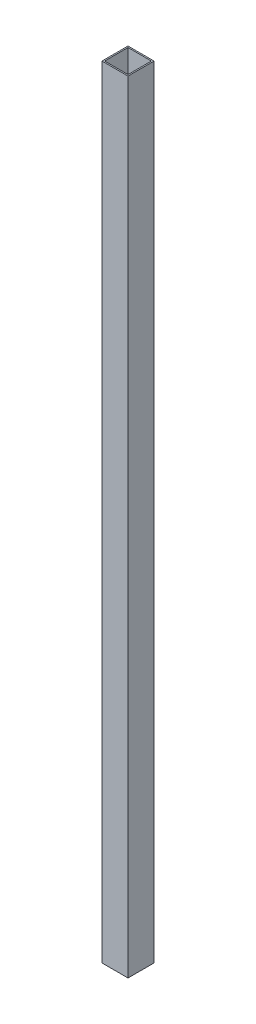
ISO-10303-21;
HEADER;
FILE_DESCRIPTION(('STEP AP214'),'2;1');
FILE_NAME('part.step','',(''),(''),'','','');
FILE_SCHEMA(('AUTOMOTIVE_DESIGN { 1 0 10303 214 1 1 1 1 }'));
ENDSEC;
DATA;
#1=APPLICATION_CONTEXT('core data for automotive mechanical design processes');
#2=APPLICATION_PROTOCOL_DEFINITION('international standard','automotive_design',2000,#1);
#3=PRODUCT_CONTEXT('',#1,'mechanical');
#4=PRODUCT('Part','Part','',(#3));
#5=PRODUCT_RELATED_PRODUCT_CATEGORY('part','',(#4));
#6=PRODUCT_DEFINITION_FORMATION('','',#4);
#7=PRODUCT_DEFINITION_CONTEXT('part definition',#1,'design');
#8=PRODUCT_DEFINITION('design','',#6,#7);
#9=PRODUCT_DEFINITION_SHAPE('','',#8);
#10=(LENGTH_UNIT() NAMED_UNIT(*) SI_UNIT(.MILLI.,.METRE.));
#11=(NAMED_UNIT(*) PLANE_ANGLE_UNIT() SI_UNIT($,.RADIAN.));
#12=(NAMED_UNIT(*) SI_UNIT($,.STERADIAN.) SOLID_ANGLE_UNIT());
#13=UNCERTAINTY_MEASURE_WITH_UNIT(LENGTH_MEASURE(1.E-05),#10,'distance_accuracy_value','');
#14=(GEOMETRIC_REPRESENTATION_CONTEXT(3) GLOBAL_UNCERTAINTY_ASSIGNED_CONTEXT((#13)) GLOBAL_UNIT_ASSIGNED_CONTEXT((#10,
#11,#12)) REPRESENTATION_CONTEXT('',''));
#15=CARTESIAN_POINT('',(0.,0.,0.));
#16=DIRECTION('',(0.,0.,1.));
#17=DIRECTION('',(1.,0.,0.));
#18=AXIS2_PLACEMENT_3D('',#15,#16,#17);
#19=CARTESIAN_POINT('',(0.,600.,0.));
#20=DIRECTION('',(0.,1.,0.));
#21=DIRECTION('',(0.,0.,1.));
#22=AXIS2_PLACEMENT_3D('',#19,#20,#21);
#23=PLANE('',#22);
#24=DIRECTION('',(0.,0.,-1.));
#25=VECTOR('',#24,1.);
#26=CARTESIAN_POINT('',(10.,600.,-10.));
#27=LINE('',#26,#25);
#28=CARTESIAN_POINT('',(10.,600.,10.));
#29=VERTEX_POINT('',#28);
#30=CARTESIAN_POINT('',(10.,600.,-10.));
#31=VERTEX_POINT('',#30);
#32=EDGE_CURVE('E159',#29,#31,#27,.T.);
#33=ORIENTED_EDGE('',*,*,#32,.T.);
#34=DIRECTION('',(-1.,0.,0.));
#35=VECTOR('',#34,1.);
#36=CARTESIAN_POINT('',(-10.,600.,-10.));
#37=LINE('',#36,#35);
#38=CARTESIAN_POINT('',(-10.,600.,-10.));
#39=VERTEX_POINT('',#38);
#40=EDGE_CURVE('E163',#31,#39,#37,.T.);
#41=ORIENTED_EDGE('',*,*,#40,.T.);
#42=DIRECTION('',(0.,0.,1.));
#43=VECTOR('',#42,1.);
#44=CARTESIAN_POINT('',(-10.,600.,-10.));
#45=LINE('',#44,#43);
#46=CARTESIAN_POINT('',(-10.,600.,10.));
#47=VERTEX_POINT('',#46);
#48=EDGE_CURVE('E167',#39,#47,#45,.T.);
#49=ORIENTED_EDGE('',*,*,#48,.T.);
#50=DIRECTION('',(1.,0.,0.));
#51=VECTOR('',#50,1.);
#52=CARTESIAN_POINT('',(-10.,600.,10.));
#53=LINE('',#52,#51);
#54=EDGE_CURVE('E170',#47,#29,#53,.T.);
#55=ORIENTED_EDGE('',*,*,#54,.T.);
#56=EDGE_LOOP('',(#33,#41,#49,#55));
#57=FACE_BOUND('',#56,.T.);
#58=DIRECTION('',(-1.,0.,0.));
#59=VECTOR('',#58,1.);
#60=CARTESIAN_POINT('',(-9.,600.,-9.));
#61=LINE('',#60,#59);
#62=CARTESIAN_POINT('',(9.,600.,-9.));
#63=VERTEX_POINT('',#62);
#64=CARTESIAN_POINT('',(-9.,600.,-9.));
#65=VERTEX_POINT('',#64);
#66=EDGE_CURVE('E120',#63,#65,#61,.T.);
#67=ORIENTED_EDGE('',*,*,#66,.F.);
#68=DIRECTION('',(0.,0.,-1.));
#69=VECTOR('',#68,1.);
#70=CARTESIAN_POINT('',(9.,600.,-9.));
#71=LINE('',#70,#69);
#72=CARTESIAN_POINT('',(9.,600.,9.));
#73=VERTEX_POINT('',#72);
#74=EDGE_CURVE('E111',#73,#63,#71,.T.);
#75=ORIENTED_EDGE('',*,*,#74,.F.);
#76=DIRECTION('',(1.,0.,0.));
#77=VECTOR('',#76,1.);
#78=CARTESIAN_POINT('',(-9.,600.,9.));
#79=LINE('',#78,#77);
#80=CARTESIAN_POINT('',(-9.,600.,9.));
#81=VERTEX_POINT('',#80);
#82=EDGE_CURVE('E137',#81,#73,#79,.T.);
#83=ORIENTED_EDGE('',*,*,#82,.F.);
#84=DIRECTION('',(0.,0.,1.));
#85=VECTOR('',#84,1.);
#86=CARTESIAN_POINT('',(-9.,600.,-9.));
#87=LINE('',#86,#85);
#88=EDGE_CURVE('E133',#65,#81,#87,.T.);
#89=ORIENTED_EDGE('',*,*,#88,.F.);
#90=EDGE_LOOP('',(#67,#75,#83,#89));
#91=FACE_BOUND('',#90,.T.);
#92=ADVANCED_FACE('F45',(#57,#91),#23,.T.);
#93=CARTESIAN_POINT('',(0.,0.,0.));
#94=DIRECTION('',(0.,1.,0.));
#95=DIRECTION('',(0.,0.,1.));
#96=AXIS2_PLACEMENT_3D('',#93,#94,#95);
#97=PLANE('',#96);
#98=DIRECTION('',(0.,0.,-1.));
#99=VECTOR('',#98,1.);
#100=CARTESIAN_POINT('',(10.,0.,-10.));
#101=LINE('',#100,#99);
#102=CARTESIAN_POINT('',(10.,0.,10.));
#103=VERTEX_POINT('',#102);
#104=CARTESIAN_POINT('',(10.,0.,-10.));
#105=VERTEX_POINT('',#104);
#106=EDGE_CURVE('E129',#103,#105,#101,.T.);
#107=ORIENTED_EDGE('',*,*,#106,.F.);
#108=DIRECTION('',(1.,0.,0.));
#109=VECTOR('',#108,1.);
#110=CARTESIAN_POINT('',(-10.,0.,10.));
#111=LINE('',#110,#109);
#112=CARTESIAN_POINT('',(-10.,0.,10.));
#113=VERTEX_POINT('',#112);
#114=EDGE_CURVE('E164',#113,#103,#111,.T.);
#115=ORIENTED_EDGE('',*,*,#114,.F.);
#116=DIRECTION('',(0.,0.,1.));
#117=VECTOR('',#116,1.);
#118=CARTESIAN_POINT('',(-10.,0.,-10.));
#119=LINE('',#118,#117);
#120=CARTESIAN_POINT('',(-10.,0.,-10.));
#121=VERTEX_POINT('',#120);
#122=EDGE_CURVE('E180',#121,#113,#119,.T.);
#123=ORIENTED_EDGE('',*,*,#122,.F.);
#124=DIRECTION('',(-1.,0.,0.));
#125=VECTOR('',#124,1.);
#126=CARTESIAN_POINT('',(-10.,0.,-10.));
#127=LINE('',#126,#125);
#128=EDGE_CURVE('E177',#105,#121,#127,.T.);
#129=ORIENTED_EDGE('',*,*,#128,.F.);
#130=EDGE_LOOP('',(#107,#115,#123,#129));
#131=FACE_BOUND('',#130,.T.);
#132=DIRECTION('',(0.,0.,-1.));
#133=VECTOR('',#132,1.);
#134=CARTESIAN_POINT('',(9.,0.,-9.));
#135=LINE('',#134,#133);
#136=CARTESIAN_POINT('',(9.,0.,9.));
#137=VERTEX_POINT('',#136);
#138=CARTESIAN_POINT('',(9.,0.,-9.));
#139=VERTEX_POINT('',#138);
#140=EDGE_CURVE('E69',#137,#139,#135,.T.);
#141=ORIENTED_EDGE('',*,*,#140,.T.);
#142=DIRECTION('',(-1.,0.,0.));
#143=VECTOR('',#142,1.);
#144=CARTESIAN_POINT('',(-9.,0.,-9.));
#145=LINE('',#144,#143);
#146=CARTESIAN_POINT('',(-9.,0.,-9.));
#147=VERTEX_POINT('',#146);
#148=EDGE_CURVE('E127',#139,#147,#145,.T.);
#149=ORIENTED_EDGE('',*,*,#148,.T.);
#150=DIRECTION('',(0.,0.,1.));
#151=VECTOR('',#150,1.);
#152=CARTESIAN_POINT('',(-9.,0.,-9.));
#153=LINE('',#152,#151);
#154=CARTESIAN_POINT('',(-9.,0.,9.));
#155=VERTEX_POINT('',#154);
#156=EDGE_CURVE('E146',#147,#155,#153,.T.);
#157=ORIENTED_EDGE('',*,*,#156,.T.);
#158=DIRECTION('',(1.,0.,0.));
#159=VECTOR('',#158,1.);
#160=CARTESIAN_POINT('',(-9.,0.,9.));
#161=LINE('',#160,#159);
#162=EDGE_CURVE('E121',#155,#137,#161,.T.);
#163=ORIENTED_EDGE('',*,*,#162,.T.);
#164=EDGE_LOOP('',(#141,#149,#157,#163));
#165=FACE_BOUND('',#164,.T.);
#166=ADVANCED_FACE('F203',(#131,#165),#97,.F.);
#167=CARTESIAN_POINT('',(10.,600.,-10.));
#168=DIRECTION('',(-1.,0.,0.));
#169=DIRECTION('',(0.,0.,1.));
#170=AXIS2_PLACEMENT_3D('',#167,#168,#169);
#171=PLANE('',#170);
#172=ORIENTED_EDGE('',*,*,#106,.T.);
#173=DIRECTION('',(0.,-1.,0.));
#174=VECTOR('',#173,1.);
#175=CARTESIAN_POINT('',(10.,600.,-10.));
#176=LINE('',#175,#174);
#177=EDGE_CURVE('E11',#31,#105,#176,.T.);
#178=ORIENTED_EDGE('',*,*,#177,.F.);
#179=ORIENTED_EDGE('',*,*,#32,.F.);
#180=DIRECTION('',(0.,-1.,0.));
#181=VECTOR('',#180,1.);
#182=CARTESIAN_POINT('',(10.,600.,10.));
#183=LINE('',#182,#181);
#184=EDGE_CURVE('E173',#29,#103,#183,.T.);
#185=ORIENTED_EDGE('',*,*,#184,.T.);
#186=EDGE_LOOP('',(#172,#178,#179,#185));
#187=FACE_BOUND('',#186,.T.);
#188=ADVANCED_FACE('F47',(#187),#171,.F.);
#189=CARTESIAN_POINT('',(-10.,600.,-10.));
#190=DIRECTION('',(0.,0.,1.));
#191=DIRECTION('',(1.,0.,0.));
#192=AXIS2_PLACEMENT_3D('',#189,#190,#191);
#193=PLANE('',#192);
#194=ORIENTED_EDGE('',*,*,#128,.T.);
#195=DIRECTION('',(0.,-1.,0.));
#196=VECTOR('',#195,1.);
#197=CARTESIAN_POINT('',(-10.,600.,-10.));
#198=LINE('',#197,#196);
#199=EDGE_CURVE('E54',#39,#121,#198,.T.);
#200=ORIENTED_EDGE('',*,*,#199,.F.);
#201=ORIENTED_EDGE('',*,*,#40,.F.);
#202=ORIENTED_EDGE('',*,*,#177,.T.);
#203=EDGE_LOOP('',(#194,#200,#201,#202));
#204=FACE_BOUND('',#203,.T.);
#205=ADVANCED_FACE('F213',(#204),#193,.F.);
#206=CARTESIAN_POINT('',(-10.,600.,-10.));
#207=DIRECTION('',(1.,0.,0.));
#208=DIRECTION('',(0.,0.,-1.));
#209=AXIS2_PLACEMENT_3D('',#206,#207,#208);
#210=PLANE('',#209);
#211=ORIENTED_EDGE('',*,*,#122,.T.);
#212=DIRECTION('',(0.,-1.,0.));
#213=VECTOR('',#212,1.);
#214=CARTESIAN_POINT('',(-10.,600.,10.));
#215=LINE('',#214,#213);
#216=EDGE_CURVE('E188',#47,#113,#215,.T.);
#217=ORIENTED_EDGE('',*,*,#216,.F.);
#218=ORIENTED_EDGE('',*,*,#48,.F.);
#219=ORIENTED_EDGE('',*,*,#199,.T.);
#220=EDGE_LOOP('',(#211,#217,#218,#219));
#221=FACE_BOUND('',#220,.T.);
#222=ADVANCED_FACE('F197',(#221),#210,.F.);
#223=CARTESIAN_POINT('',(-10.,600.,10.));
#224=DIRECTION('',(0.,0.,-1.));
#225=DIRECTION('',(-1.,0.,0.));
#226=AXIS2_PLACEMENT_3D('',#223,#224,#225);
#227=PLANE('',#226);
#228=ORIENTED_EDGE('',*,*,#114,.T.);
#229=ORIENTED_EDGE('',*,*,#184,.F.);
#230=ORIENTED_EDGE('',*,*,#54,.F.);
#231=ORIENTED_EDGE('',*,*,#216,.T.);
#232=EDGE_LOOP('',(#228,#229,#230,#231));
#233=FACE_BOUND('',#232,.T.);
#234=ADVANCED_FACE('F207',(#233),#227,.F.);
#235=CARTESIAN_POINT('',(9.,600.,-9.));
#236=DIRECTION('',(-1.,0.,0.));
#237=DIRECTION('',(0.,0.,1.));
#238=AXIS2_PLACEMENT_3D('',#235,#236,#237);
#239=PLANE('',#238);
#240=ORIENTED_EDGE('',*,*,#140,.F.);
#241=DIRECTION('',(0.,-1.,0.));
#242=VECTOR('',#241,1.);
#243=CARTESIAN_POINT('',(9.,600.,9.));
#244=LINE('',#243,#242);
#245=EDGE_CURVE('E115',#73,#137,#244,.T.);
#246=ORIENTED_EDGE('',*,*,#245,.F.);
#247=ORIENTED_EDGE('',*,*,#74,.T.);
#248=DIRECTION('',(0.,-1.,0.));
#249=VECTOR('',#248,1.);
#250=CARTESIAN_POINT('',(9.,600.,-9.));
#251=LINE('',#250,#249);
#252=EDGE_CURVE('E114',#63,#139,#251,.T.);
#253=ORIENTED_EDGE('',*,*,#252,.T.);
#254=EDGE_LOOP('',(#240,#246,#247,#253));
#255=FACE_BOUND('',#254,.T.);
#256=ADVANCED_FACE('F113',(#255),#239,.T.);
#257=CARTESIAN_POINT('',(-9.,600.,-9.));
#258=DIRECTION('',(0.,0.,1.));
#259=DIRECTION('',(1.,0.,0.));
#260=AXIS2_PLACEMENT_3D('',#257,#258,#259);
#261=PLANE('',#260);
#262=ORIENTED_EDGE('',*,*,#148,.F.);
#263=ORIENTED_EDGE('',*,*,#252,.F.);
#264=ORIENTED_EDGE('',*,*,#66,.T.);
#265=DIRECTION('',(0.,-1.,0.));
#266=VECTOR('',#265,1.);
#267=CARTESIAN_POINT('',(-9.,600.,-9.));
#268=LINE('',#267,#266);
#269=EDGE_CURVE('E130',#65,#147,#268,.T.);
#270=ORIENTED_EDGE('',*,*,#269,.T.);
#271=EDGE_LOOP('',(#262,#263,#264,#270));
#272=FACE_BOUND('',#271,.T.);
#273=ADVANCED_FACE('F124',(#272),#261,.T.);
#274=CARTESIAN_POINT('',(-9.,600.,-9.));
#275=DIRECTION('',(1.,0.,0.));
#276=DIRECTION('',(0.,0.,-1.));
#277=AXIS2_PLACEMENT_3D('',#274,#275,#276);
#278=PLANE('',#277);
#279=ORIENTED_EDGE('',*,*,#156,.F.);
#280=ORIENTED_EDGE('',*,*,#269,.F.);
#281=ORIENTED_EDGE('',*,*,#88,.T.);
#282=DIRECTION('',(0.,-1.,0.));
#283=VECTOR('',#282,1.);
#284=CARTESIAN_POINT('',(-9.,600.,9.));
#285=LINE('',#284,#283);
#286=EDGE_CURVE('E61',#81,#155,#285,.T.);
#287=ORIENTED_EDGE('',*,*,#286,.T.);
#288=EDGE_LOOP('',(#279,#280,#281,#287));
#289=FACE_BOUND('',#288,.T.);
#290=ADVANCED_FACE('F236',(#289),#278,.T.);
#291=CARTESIAN_POINT('',(-9.,600.,9.));
#292=DIRECTION('',(0.,0.,-1.));
#293=DIRECTION('',(-1.,0.,0.));
#294=AXIS2_PLACEMENT_3D('',#291,#292,#293);
#295=PLANE('',#294);
#296=ORIENTED_EDGE('',*,*,#162,.F.);
#297=ORIENTED_EDGE('',*,*,#286,.F.);
#298=ORIENTED_EDGE('',*,*,#82,.T.);
#299=ORIENTED_EDGE('',*,*,#245,.T.);
#300=EDGE_LOOP('',(#296,#297,#298,#299));
#301=FACE_BOUND('',#300,.T.);
#302=ADVANCED_FACE('F240',(#301),#295,.T.);
#303=CLOSED_SHELL('',(#92,#166,#188,#205,#222,#234,#256,#273,#290,#302));
#304=MANIFOLD_SOLID_BREP('B2',#303);
#305=ADVANCED_BREP_SHAPE_REPRESENTATION('',(#18,#304),#14);
#306=SHAPE_DEFINITION_REPRESENTATION(#9,#305);
ENDSEC;
END-ISO-10303-21;
